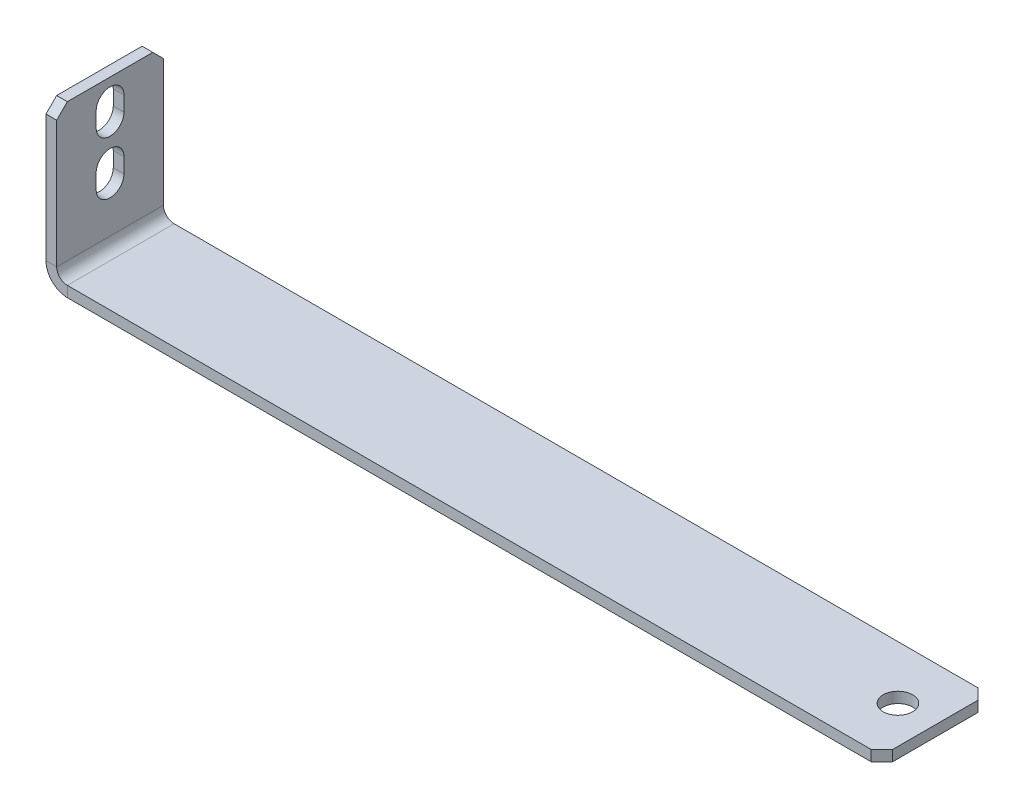
ISO-10303-21;
HEADER;
FILE_DESCRIPTION(('STEP AP214'),'2;1');
FILE_NAME('part.step','',(''),(''),'','','');
FILE_SCHEMA(('AUTOMOTIVE_DESIGN { 1 0 10303 214 1 1 1 1 }'));
ENDSEC;
DATA;
#1=APPLICATION_CONTEXT('core data for automotive mechanical design processes');
#2=APPLICATION_PROTOCOL_DEFINITION('international standard','automotive_design',2000,#1);
#3=PRODUCT_CONTEXT('',#1,'mechanical');
#4=PRODUCT('Part','Part','',(#3));
#5=PRODUCT_RELATED_PRODUCT_CATEGORY('part','',(#4));
#6=PRODUCT_DEFINITION_FORMATION('','',#4);
#7=PRODUCT_DEFINITION_CONTEXT('part definition',#1,'design');
#8=PRODUCT_DEFINITION('design','',#6,#7);
#9=PRODUCT_DEFINITION_SHAPE('','',#8);
#10=(LENGTH_UNIT() NAMED_UNIT(*) SI_UNIT(.MILLI.,.METRE.));
#11=(NAMED_UNIT(*) PLANE_ANGLE_UNIT() SI_UNIT($,.RADIAN.));
#12=(NAMED_UNIT(*) SI_UNIT($,.STERADIAN.) SOLID_ANGLE_UNIT());
#13=UNCERTAINTY_MEASURE_WITH_UNIT(LENGTH_MEASURE(1.E-05),#10,'distance_accuracy_value','');
#14=(GEOMETRIC_REPRESENTATION_CONTEXT(3) GLOBAL_UNCERTAINTY_ASSIGNED_CONTEXT((#13)) GLOBAL_UNIT_ASSIGNED_CONTEXT((#10,
#11,#12)) REPRESENTATION_CONTEXT('',''));
#15=CARTESIAN_POINT('',(0.,0.,0.));
#16=DIRECTION('',(0.,0.,1.));
#17=DIRECTION('',(1.,0.,0.));
#18=AXIS2_PLACEMENT_3D('',#15,#16,#17);
#19=CARTESIAN_POINT('',(-391.45,10.,50.));
#20=DIRECTION('',(0.,0.,1.));
#21=DIRECTION('',(1.,0.,0.));
#22=AXIS2_PLACEMENT_3D('',#19,#20,#21);
#23=PLANE('',#22);
#24=DIRECTION('',(1.,0.,0.));
#25=VECTOR('',#24,1.);
#26=CARTESIAN_POINT('',(-391.45,10.,50.));
#27=LINE('',#26,#25);
#28=CARTESIAN_POINT('',(-391.45,10.,50.));
#29=VERTEX_POINT('',#28);
#30=CARTESIAN_POINT('',(-386.45,10.,50.));
#31=VERTEX_POINT('',#30);
#32=EDGE_CURVE('E316',#29,#31,#27,.T.);
#33=ORIENTED_EDGE('',*,*,#32,.F.);
#34=CARTESIAN_POINT('',(-381.45,10.,50.));
#35=DIRECTION('',(0.,0.,1.));
#36=DIRECTION('',(1.,0.,0.));
#37=AXIS2_PLACEMENT_3D('',#34,#35,#36);
#38=CIRCLE('',#37,10.);
#39=CARTESIAN_POINT('',(-381.45,0.,50.));
#40=VERTEX_POINT('',#39);
#41=EDGE_CURVE('E272',#29,#40,#38,.T.);
#42=ORIENTED_EDGE('',*,*,#41,.T.);
#43=DIRECTION('',(0.,-1.,0.));
#44=VECTOR('',#43,1.);
#45=CARTESIAN_POINT('',(-381.45,5.,50.));
#46=LINE('',#45,#44);
#47=CARTESIAN_POINT('',(-381.45,5.,50.));
#48=VERTEX_POINT('',#47);
#49=EDGE_CURVE('E314',#48,#40,#46,.T.);
#50=ORIENTED_EDGE('',*,*,#49,.F.);
#51=CARTESIAN_POINT('',(-381.45,10.,50.));
#52=DIRECTION('',(0.,0.,1.));
#53=DIRECTION('',(1.,0.,0.));
#54=AXIS2_PLACEMENT_3D('',#51,#52,#53);
#55=CIRCLE('',#54,5.);
#56=EDGE_CURVE('E265',#31,#48,#55,.T.);
#57=ORIENTED_EDGE('',*,*,#56,.F.);
#58=EDGE_LOOP('',(#33,#42,#50,#57));
#59=FACE_BOUND('',#58,.T.);
#60=ADVANCED_FACE('F45',(#59),#23,.T.);
#61=CARTESIAN_POINT('',(-381.45,5.,50.));
#62=DIRECTION('',(0.,0.,1.));
#63=DIRECTION('',(1.,0.,0.));
#64=AXIS2_PLACEMENT_3D('',#61,#62,#63);
#65=PLANE('',#64);
#66=DIRECTION('',(0.,1.,0.));
#67=VECTOR('',#66,1.);
#68=CARTESIAN_POINT('',(-386.45,0.,50.));
#69=LINE('',#68,#67);
#70=CARTESIAN_POINT('',(-386.45,69.5,50.));
#71=VERTEX_POINT('',#70);
#72=EDGE_CURVE('E268',#71,#31,#69,.F.);
#73=ORIENTED_EDGE('',*,*,#72,.F.);
#74=DIRECTION('',(-1.,0.,0.));
#75=VECTOR('',#74,1.);
#76=CARTESIAN_POINT('',(-381.45,69.5,50.));
#77=LINE('',#76,#75);
#78=CARTESIAN_POINT('',(-391.45,69.5,50.));
#79=VERTEX_POINT('',#78);
#80=EDGE_CURVE('E335',#71,#79,#77,.T.);
#81=ORIENTED_EDGE('',*,*,#80,.T.);
#82=DIRECTION('',(0.,-1.,0.));
#83=VECTOR('',#82,1.);
#84=CARTESIAN_POINT('',(-391.45,0.,50.));
#85=LINE('',#84,#83);
#86=EDGE_CURVE('E270',#79,#29,#85,.T.);
#87=ORIENTED_EDGE('',*,*,#86,.T.);
#88=ORIENTED_EDGE('',*,*,#32,.T.);
#89=EDGE_LOOP('',(#73,#81,#87,#88));
#90=FACE_BOUND('',#89,.T.);
#91=ADVANCED_FACE('F398',(#90),#65,.T.);
#92=CARTESIAN_POINT('',(-381.45,0.,0.));
#93=DIRECTION('',(0.,0.,-1.));
#94=DIRECTION('',(-1.,0.,0.));
#95=AXIS2_PLACEMENT_3D('',#92,#93,#94);
#96=PLANE('',#95);
#97=DIRECTION('',(0.,1.,0.));
#98=VECTOR('',#97,1.);
#99=CARTESIAN_POINT('',(-381.45,0.,0.));
#100=LINE('',#99,#98);
#101=CARTESIAN_POINT('',(-381.45,0.,0.));
#102=VERTEX_POINT('',#101);
#103=CARTESIAN_POINT('',(-381.45,5.,0.));
#104=VERTEX_POINT('',#103);
#105=EDGE_CURVE('E312',#102,#104,#100,.T.);
#106=ORIENTED_EDGE('',*,*,#105,.F.);
#107=CARTESIAN_POINT('',(-381.45,10.,0.));
#108=DIRECTION('',(0.,0.,1.));
#109=DIRECTION('',(1.,0.,0.));
#110=AXIS2_PLACEMENT_3D('',#107,#108,#109);
#111=CIRCLE('',#110,10.);
#112=CARTESIAN_POINT('',(-391.45,10.,0.));
#113=VERTEX_POINT('',#112);
#114=EDGE_CURVE('E263',#113,#102,#111,.T.);
#115=ORIENTED_EDGE('',*,*,#114,.F.);
#116=DIRECTION('',(-1.,0.,0.));
#117=VECTOR('',#116,1.);
#118=CARTESIAN_POINT('',(-386.45,10.,0.));
#119=LINE('',#118,#117);
#120=CARTESIAN_POINT('',(-386.45,10.,0.));
#121=VERTEX_POINT('',#120);
#122=EDGE_CURVE('E309',#121,#113,#119,.T.);
#123=ORIENTED_EDGE('',*,*,#122,.F.);
#124=CARTESIAN_POINT('',(-381.45,10.,0.));
#125=DIRECTION('',(0.,0.,1.));
#126=DIRECTION('',(1.,0.,0.));
#127=AXIS2_PLACEMENT_3D('',#124,#125,#126);
#128=CIRCLE('',#127,5.);
#129=EDGE_CURVE('E281',#121,#104,#128,.T.);
#130=ORIENTED_EDGE('',*,*,#129,.T.);
#131=EDGE_LOOP('',(#106,#115,#123,#130));
#132=FACE_BOUND('',#131,.T.);
#133=ADVANCED_FACE('F388',(#132),#96,.T.);
#134=CARTESIAN_POINT('',(-386.45,10.,0.));
#135=DIRECTION('',(0.,0.,-1.));
#136=DIRECTION('',(-1.,0.,0.));
#137=AXIS2_PLACEMENT_3D('',#134,#135,#136);
#138=PLANE('',#137);
#139=DIRECTION('',(1.,0.,0.));
#140=VECTOR('',#139,1.);
#141=CARTESIAN_POINT('',(-391.45,5.,0.));
#142=LINE('',#141,#140);
#143=CARTESIAN_POINT('',(-5.00000000000006,5.,0.));
#144=VERTEX_POINT('',#143);
#145=EDGE_CURVE('E278',#104,#144,#142,.T.);
#146=ORIENTED_EDGE('',*,*,#145,.T.);
#147=DIRECTION('',(0.,-1.,0.));
#148=VECTOR('',#147,1.);
#149=CARTESIAN_POINT('',(-5.00000000000006,10.,0.));
#150=LINE('',#149,#148);
#151=CARTESIAN_POINT('',(-5.00000000000006,0.,0.));
#152=VERTEX_POINT('',#151);
#153=EDGE_CURVE('E339',#144,#152,#150,.T.);
#154=ORIENTED_EDGE('',*,*,#153,.T.);
#155=DIRECTION('',(1.,0.,0.));
#156=VECTOR('',#155,1.);
#157=CARTESIAN_POINT('',(-391.45,0.,0.));
#158=LINE('',#157,#156);
#159=EDGE_CURVE('E259',#102,#152,#158,.T.);
#160=ORIENTED_EDGE('',*,*,#159,.F.);
#161=ORIENTED_EDGE('',*,*,#105,.T.);
#162=EDGE_LOOP('',(#146,#154,#160,#161));
#163=FACE_BOUND('',#162,.T.);
#164=ADVANCED_FACE('F371',(#163),#138,.T.);
#165=CARTESIAN_POINT('',(-391.45,0.,50.));
#166=DIRECTION('',(0.,1.,0.));
#167=DIRECTION('',(0.,0.,1.));
#168=AXIS2_PLACEMENT_3D('',#165,#166,#167);
#169=PLANE('',#168);
#170=CARTESIAN_POINT('',(-17.5,0.,25.));
#171=DIRECTION('',(0.,1.,0.));
#172=DIRECTION('',(0.,0.,1.));
#173=AXIS2_PLACEMENT_3D('',#170,#171,#172);
#174=CIRCLE('',#173,6.90000000000001);
#175=CARTESIAN_POINT('',(-17.5,0.,31.9));
#176=VERTEX_POINT('',#175);
#177=EDGE_CURVE('E256',#176,#176,#174,.T.);
#178=ORIENTED_EDGE('',*,*,#177,.T.);
#179=EDGE_LOOP('',(#178));
#180=FACE_BOUND('',#179,.T.);
#181=DIRECTION('',(0.,0.,-1.));
#182=VECTOR('',#181,1.);
#183=CARTESIAN_POINT('',(0.,0.,50.));
#184=LINE('',#183,#182);
#185=CARTESIAN_POINT('',(0.,0.,45.));
#186=VERTEX_POINT('',#185);
#187=CARTESIAN_POINT('',(0.,0.,5.00000000000003));
#188=VERTEX_POINT('',#187);
#189=EDGE_CURVE('E307',#186,#188,#184,.T.);
#190=ORIENTED_EDGE('',*,*,#189,.F.);
#191=DIRECTION('',(0.707106781186549,0.,-0.707106781186546));
#192=VECTOR('',#191,1.);
#193=CARTESIAN_POINT('',(0.,0.,45.));
#194=LINE('',#193,#192);
#195=CARTESIAN_POINT('',(-5.00000000000006,0.,50.));
#196=VERTEX_POINT('',#195);
#197=EDGE_CURVE('E67',#186,#196,#194,.F.);
#198=ORIENTED_EDGE('',*,*,#197,.T.);
#199=DIRECTION('',(1.,0.,0.));
#200=VECTOR('',#199,1.);
#201=CARTESIAN_POINT('',(-391.45,0.,50.));
#202=LINE('',#201,#200);
#203=EDGE_CURVE('E260',#40,#196,#202,.T.);
#204=ORIENTED_EDGE('',*,*,#203,.F.);
#205=DIRECTION('',(0.,0.,-1.));
#206=VECTOR('',#205,1.);
#207=CARTESIAN_POINT('',(-381.45,0.,50.));
#208=LINE('',#207,#206);
#209=EDGE_CURVE('E275',#40,#102,#208,.T.);
#210=ORIENTED_EDGE('',*,*,#209,.T.);
#211=ORIENTED_EDGE('',*,*,#159,.T.);
#212=DIRECTION('',(-0.707106781186549,0.,-0.707106781186546));
#213=VECTOR('',#212,1.);
#214=CARTESIAN_POINT('',(-5.00000000000006,0.,0.));
#215=LINE('',#214,#213);
#216=EDGE_CURVE('E342',#152,#188,#215,.F.);
#217=ORIENTED_EDGE('',*,*,#216,.T.);
#218=EDGE_LOOP('',(#190,#198,#204,#210,#211,#217));
#219=FACE_BOUND('',#218,.T.);
#220=ADVANCED_FACE('F359',(#180,#219),#169,.F.);
#221=CARTESIAN_POINT('',(0.,5.,50.));
#222=DIRECTION('',(1.,0.,0.));
#223=DIRECTION('',(0.,0.,-1.));
#224=AXIS2_PLACEMENT_3D('',#221,#222,#223);
#225=PLANE('',#224);
#226=DIRECTION('',(0.,0.,-1.));
#227=VECTOR('',#226,1.);
#228=CARTESIAN_POINT('',(0.,5.,50.));
#229=LINE('',#228,#227);
#230=CARTESIAN_POINT('',(0.,5.,45.));
#231=VERTEX_POINT('',#230);
#232=CARTESIAN_POINT('',(0.,5.,5.00000000000003));
#233=VERTEX_POINT('',#232);
#234=EDGE_CURVE('E305',#231,#233,#229,.T.);
#235=ORIENTED_EDGE('',*,*,#234,.F.);
#236=DIRECTION('',(0.,-1.,0.));
#237=VECTOR('',#236,1.);
#238=CARTESIAN_POINT('',(0.,5.,45.));
#239=LINE('',#238,#237);
#240=EDGE_CURVE('E350',#231,#186,#239,.T.);
#241=ORIENTED_EDGE('',*,*,#240,.T.);
#242=ORIENTED_EDGE('',*,*,#189,.T.);
#243=DIRECTION('',(0.,1.,0.));
#244=VECTOR('',#243,1.);
#245=CARTESIAN_POINT('',(0.,5.,5.00000000000003));
#246=LINE('',#245,#244);
#247=EDGE_CURVE('E345',#188,#233,#246,.T.);
#248=ORIENTED_EDGE('',*,*,#247,.T.);
#249=EDGE_LOOP('',(#235,#241,#242,#248));
#250=FACE_BOUND('',#249,.T.);
#251=ADVANCED_FACE('F356',(#250),#225,.T.);
#252=CARTESIAN_POINT('',(-391.45,5.,50.));
#253=DIRECTION('',(0.,1.,0.));
#254=DIRECTION('',(0.,0.,1.));
#255=AXIS2_PLACEMENT_3D('',#252,#253,#254);
#256=PLANE('',#255);
#257=CARTESIAN_POINT('',(-17.5,5.,25.));
#258=DIRECTION('',(0.,1.,0.));
#259=DIRECTION('',(0.,0.,1.));
#260=AXIS2_PLACEMENT_3D('',#257,#258,#259);
#261=CIRCLE('',#260,6.90000000000001);
#262=CARTESIAN_POINT('',(-17.5,5.,31.9));
#263=VERTEX_POINT('',#262);
#264=EDGE_CURVE('E253',#263,#263,#261,.T.);
#265=ORIENTED_EDGE('',*,*,#264,.F.);
#266=EDGE_LOOP('',(#265));
#267=FACE_BOUND('',#266,.T.);
#268=DIRECTION('',(1.,0.,0.));
#269=VECTOR('',#268,1.);
#270=CARTESIAN_POINT('',(-391.45,5.,50.));
#271=LINE('',#270,#269);
#272=CARTESIAN_POINT('',(-5.00000000000006,5.,50.));
#273=VERTEX_POINT('',#272);
#274=EDGE_CURVE('E262',#48,#273,#271,.T.);
#275=ORIENTED_EDGE('',*,*,#274,.T.);
#276=DIRECTION('',(-0.707106781186549,0.,0.707106781186546));
#277=VECTOR('',#276,1.);
#278=CARTESIAN_POINT('',(-198.225000000001,5.,243.225));
#279=LINE('',#278,#277);
#280=EDGE_CURVE('E11',#273,#231,#279,.F.);
#281=ORIENTED_EDGE('',*,*,#280,.T.);
#282=ORIENTED_EDGE('',*,*,#234,.T.);
#283=DIRECTION('',(0.707106781186549,0.,0.707106781186546));
#284=VECTOR('',#283,1.);
#285=CARTESIAN_POINT('',(-173.225000000001,5.,-168.225));
#286=LINE('',#285,#284);
#287=EDGE_CURVE('E348',#233,#144,#286,.F.);
#288=ORIENTED_EDGE('',*,*,#287,.T.);
#289=ORIENTED_EDGE('',*,*,#145,.F.);
#290=DIRECTION('',(0.,0.,-1.));
#291=VECTOR('',#290,1.);
#292=CARTESIAN_POINT('',(-381.45,5.,50.));
#293=LINE('',#292,#291);
#294=EDGE_CURVE('E302',#48,#104,#293,.T.);
#295=ORIENTED_EDGE('',*,*,#294,.F.);
#296=EDGE_LOOP('',(#275,#281,#282,#288,#289,#295));
#297=FACE_BOUND('',#296,.T.);
#298=ADVANCED_FACE('F368',(#267,#297),#256,.T.);
#299=CARTESIAN_POINT('',(-381.45,10.,50.));
#300=DIRECTION('',(0.,0.,-1.));
#301=DIRECTION('',(-1.,0.,0.));
#302=AXIS2_PLACEMENT_3D('',#299,#300,#301);
#303=CYLINDRICAL_SURFACE('',#302,5.);
#304=ORIENTED_EDGE('',*,*,#129,.F.);
#305=DIRECTION('',(0.,0.,-1.));
#306=VECTOR('',#305,1.);
#307=CARTESIAN_POINT('',(-386.45,10.,50.));
#308=LINE('',#307,#306);
#309=EDGE_CURVE('E299',#31,#121,#308,.T.);
#310=ORIENTED_EDGE('',*,*,#309,.F.);
#311=ORIENTED_EDGE('',*,*,#56,.T.);
#312=ORIENTED_EDGE('',*,*,#294,.T.);
#313=EDGE_LOOP('',(#304,#310,#311,#312));
#314=FACE_BOUND('',#313,.T.);
#315=ADVANCED_FACE('F376',(#314),#303,.F.);
#316=CARTESIAN_POINT('',(-386.45,0.,50.));
#317=DIRECTION('',(1.,0.,0.));
#318=DIRECTION('',(0.,0.,-1.));
#319=AXIS2_PLACEMENT_3D('',#316,#317,#318);
#320=PLANE('',#319);
#321=DIRECTION('',(0.,1.,0.));
#322=VECTOR('',#321,1.);
#323=CARTESIAN_POINT('',(-386.45,0.,18.5));
#324=LINE('',#323,#322);
#325=CARTESIAN_POINT('',(-386.45,32.,18.5));
#326=VERTEX_POINT('',#325);
#327=CARTESIAN_POINT('',(-386.45,39.,18.5));
#328=VERTEX_POINT('',#327);
#329=EDGE_CURVE('E251',#326,#328,#324,.T.);
#330=ORIENTED_EDGE('',*,*,#329,.F.);
#331=CARTESIAN_POINT('',(-386.45,32.,25.));
#332=DIRECTION('',(1.,0.,0.));
#333=DIRECTION('',(0.,0.,-1.));
#334=AXIS2_PLACEMENT_3D('',#331,#332,#333);
#335=CIRCLE('',#334,6.5);
#336=CARTESIAN_POINT('',(-386.45,32.,31.5));
#337=VERTEX_POINT('',#336);
#338=EDGE_CURVE('E246',#337,#326,#335,.T.);
#339=ORIENTED_EDGE('',*,*,#338,.F.);
#340=DIRECTION('',(0.,1.,0.));
#341=VECTOR('',#340,1.);
#342=CARTESIAN_POINT('',(-386.45,0.,31.5));
#343=LINE('',#342,#341);
#344=CARTESIAN_POINT('',(-386.45,39.,31.5));
#345=VERTEX_POINT('',#344);
#346=EDGE_CURVE('E190',#337,#345,#343,.T.);
#347=ORIENTED_EDGE('',*,*,#346,.T.);
#348=CARTESIAN_POINT('',(-386.45,39.,25.));
#349=DIRECTION('',(1.,0.,0.));
#350=DIRECTION('',(0.,0.,-1.));
#351=AXIS2_PLACEMENT_3D('',#348,#349,#350);
#352=CIRCLE('',#351,6.5);
#353=EDGE_CURVE('E249',#328,#345,#352,.T.);
#354=ORIENTED_EDGE('',*,*,#353,.F.);
#355=EDGE_LOOP('',(#330,#339,#347,#354));
#356=FACE_BOUND('',#355,.T.);
#357=DIRECTION('',(0.,1.,0.));
#358=VECTOR('',#357,1.);
#359=CARTESIAN_POINT('',(-386.45,0.,18.5));
#360=LINE('',#359,#358);
#361=CARTESIAN_POINT('',(-386.45,57.,18.5));
#362=VERTEX_POINT('',#361);
#363=CARTESIAN_POINT('',(-386.45,64.,18.5));
#364=VERTEX_POINT('',#363);
#365=EDGE_CURVE('E244',#362,#364,#360,.T.);
#366=ORIENTED_EDGE('',*,*,#365,.F.);
#367=CARTESIAN_POINT('',(-386.45,57.,25.));
#368=DIRECTION('',(1.,0.,0.));
#369=DIRECTION('',(0.,0.,-1.));
#370=AXIS2_PLACEMENT_3D('',#367,#368,#369);
#371=CIRCLE('',#370,6.5);
#372=CARTESIAN_POINT('',(-386.45,57.,31.5));
#373=VERTEX_POINT('',#372);
#374=EDGE_CURVE('E215',#373,#362,#371,.T.);
#375=ORIENTED_EDGE('',*,*,#374,.F.);
#376=DIRECTION('',(0.,1.,0.));
#377=VECTOR('',#376,1.);
#378=CARTESIAN_POINT('',(-386.45,0.,31.5));
#379=LINE('',#378,#377);
#380=CARTESIAN_POINT('',(-386.45,64.,31.5));
#381=VERTEX_POINT('',#380);
#382=EDGE_CURVE('E239',#373,#381,#379,.T.);
#383=ORIENTED_EDGE('',*,*,#382,.T.);
#384=CARTESIAN_POINT('',(-386.45,64.,25.));
#385=DIRECTION('',(1.,0.,0.));
#386=DIRECTION('',(0.,0.,-1.));
#387=AXIS2_PLACEMENT_3D('',#384,#385,#386);
#388=CIRCLE('',#387,6.5);
#389=EDGE_CURVE('E242',#364,#381,#388,.T.);
#390=ORIENTED_EDGE('',*,*,#389,.F.);
#391=EDGE_LOOP('',(#366,#375,#383,#390));
#392=FACE_BOUND('',#391,.T.);
#393=DIRECTION('',(0.,0.,-1.));
#394=VECTOR('',#393,1.);
#395=CARTESIAN_POINT('',(-386.45,74.5,50.));
#396=LINE('',#395,#394);
#397=CARTESIAN_POINT('',(-386.45,74.5,45.));
#398=VERTEX_POINT('',#397);
#399=CARTESIAN_POINT('',(-386.45,74.5,5.00000000000003));
#400=VERTEX_POINT('',#399);
#401=EDGE_CURVE('E297',#398,#400,#396,.T.);
#402=ORIENTED_EDGE('',*,*,#401,.F.);
#403=DIRECTION('',(0.,0.707106781186548,-0.707106781186548));
#404=VECTOR('',#403,1.);
#405=CARTESIAN_POINT('',(-386.45,34.75,84.75));
#406=LINE('',#405,#404);
#407=EDGE_CURVE('E333',#398,#71,#406,.F.);
#408=ORIENTED_EDGE('',*,*,#407,.T.);
#409=ORIENTED_EDGE('',*,*,#72,.T.);
#410=ORIENTED_EDGE('',*,*,#309,.T.);
#411=DIRECTION('',(0.,1.,0.));
#412=VECTOR('',#411,1.);
#413=CARTESIAN_POINT('',(-386.45,0.,0.));
#414=LINE('',#413,#412);
#415=CARTESIAN_POINT('',(-386.45,69.5,0.));
#416=VERTEX_POINT('',#415);
#417=EDGE_CURVE('E284',#416,#121,#414,.F.);
#418=ORIENTED_EDGE('',*,*,#417,.F.);
#419=DIRECTION('',(0.,0.707106781186548,0.707106781186548));
#420=VECTOR('',#419,1.);
#421=CARTESIAN_POINT('',(-386.45,59.75,-9.74999999999997));
#422=LINE('',#421,#420);
#423=EDGE_CURVE('E322',#416,#400,#422,.T.);
#424=ORIENTED_EDGE('',*,*,#423,.T.);
#425=EDGE_LOOP('',(#402,#408,#409,#410,#418,#424));
#426=FACE_BOUND('',#425,.T.);
#427=ADVANCED_FACE('F394',(#356,#392,#426),#320,.T.);
#428=CARTESIAN_POINT('',(-391.45,74.5,50.));
#429=DIRECTION('',(0.,1.,0.));
#430=DIRECTION('',(0.,0.,1.));
#431=AXIS2_PLACEMENT_3D('',#428,#429,#430);
#432=PLANE('',#431);
#433=DIRECTION('',(0.,0.,-1.));
#434=VECTOR('',#433,1.);
#435=CARTESIAN_POINT('',(-391.45,74.5,50.));
#436=LINE('',#435,#434);
#437=CARTESIAN_POINT('',(-391.45,74.5,45.));
#438=VERTEX_POINT('',#437);
#439=CARTESIAN_POINT('',(-391.45,74.5,5.00000000000003));
#440=VERTEX_POINT('',#439);
#441=EDGE_CURVE('E295',#438,#440,#436,.T.);
#442=ORIENTED_EDGE('',*,*,#441,.F.);
#443=DIRECTION('',(1.,0.,0.));
#444=VECTOR('',#443,1.);
#445=CARTESIAN_POINT('',(-391.45,74.5,45.));
#446=LINE('',#445,#444);
#447=EDGE_CURVE('E330',#438,#398,#446,.T.);
#448=ORIENTED_EDGE('',*,*,#447,.T.);
#449=ORIENTED_EDGE('',*,*,#401,.T.);
#450=DIRECTION('',(-1.,0.,0.));
#451=VECTOR('',#450,1.);
#452=CARTESIAN_POINT('',(-391.45,74.5,5.00000000000003));
#453=LINE('',#452,#451);
#454=EDGE_CURVE('E325',#400,#440,#453,.T.);
#455=ORIENTED_EDGE('',*,*,#454,.T.);
#456=EDGE_LOOP('',(#442,#448,#449,#455));
#457=FACE_BOUND('',#456,.T.);
#458=ADVANCED_FACE('F407',(#457),#432,.T.);
#459=CARTESIAN_POINT('',(-391.45,0.,50.));
#460=DIRECTION('',(1.,0.,0.));
#461=DIRECTION('',(0.,0.,-1.));
#462=AXIS2_PLACEMENT_3D('',#459,#460,#461);
#463=PLANE('',#462);
#464=CARTESIAN_POINT('',(-391.45,32.,25.));
#465=DIRECTION('',(-1.,0.,0.));
#466=DIRECTION('',(0.,0.,1.));
#467=AXIS2_PLACEMENT_3D('',#464,#465,#466);
#468=CIRCLE('',#467,6.5);
#469=CARTESIAN_POINT('',(-391.45,32.,18.5));
#470=VERTEX_POINT('',#469);
#471=CARTESIAN_POINT('',(-391.45,32.,31.5));
#472=VERTEX_POINT('',#471);
#473=EDGE_CURVE('E198',#470,#472,#468,.T.);
#474=ORIENTED_EDGE('',*,*,#473,.F.);
#475=DIRECTION('',(0.,-1.,0.));
#476=VECTOR('',#475,1.);
#477=CARTESIAN_POINT('',(-391.45,0.,18.5));
#478=LINE('',#477,#476);
#479=CARTESIAN_POINT('',(-391.45,39.,18.5));
#480=VERTEX_POINT('',#479);
#481=EDGE_CURVE('E203',#480,#470,#478,.T.);
#482=ORIENTED_EDGE('',*,*,#481,.F.);
#483=CARTESIAN_POINT('',(-391.45,39.,25.));
#484=DIRECTION('',(-1.,0.,0.));
#485=DIRECTION('',(0.,0.,1.));
#486=AXIS2_PLACEMENT_3D('',#483,#484,#485);
#487=CIRCLE('',#486,6.5);
#488=CARTESIAN_POINT('',(-391.45,39.,31.5));
#489=VERTEX_POINT('',#488);
#490=EDGE_CURVE('E208',#489,#480,#487,.T.);
#491=ORIENTED_EDGE('',*,*,#490,.F.);
#492=DIRECTION('',(0.,-1.,0.));
#493=VECTOR('',#492,1.);
#494=CARTESIAN_POINT('',(-391.45,0.,31.5));
#495=LINE('',#494,#493);
#496=EDGE_CURVE('E187',#489,#472,#495,.T.);
#497=ORIENTED_EDGE('',*,*,#496,.T.);
#498=EDGE_LOOP('',(#474,#482,#491,#497));
#499=FACE_BOUND('',#498,.T.);
#500=CARTESIAN_POINT('',(-391.45,57.,25.));
#501=DIRECTION('',(-1.,0.,0.));
#502=DIRECTION('',(0.,0.,1.));
#503=AXIS2_PLACEMENT_3D('',#500,#501,#502);
#504=CIRCLE('',#503,6.5);
#505=CARTESIAN_POINT('',(-391.45,57.,18.5));
#506=VERTEX_POINT('',#505);
#507=CARTESIAN_POINT('',(-391.45,57.,31.5));
#508=VERTEX_POINT('',#507);
#509=EDGE_CURVE('E220',#506,#508,#504,.T.);
#510=ORIENTED_EDGE('',*,*,#509,.F.);
#511=DIRECTION('',(0.,-1.,0.));
#512=VECTOR('',#511,1.);
#513=CARTESIAN_POINT('',(-391.45,0.,18.5));
#514=LINE('',#513,#512);
#515=CARTESIAN_POINT('',(-391.45,64.,18.5));
#516=VERTEX_POINT('',#515);
#517=EDGE_CURVE('E218',#516,#506,#514,.T.);
#518=ORIENTED_EDGE('',*,*,#517,.F.);
#519=CARTESIAN_POINT('',(-391.45,64.,25.));
#520=DIRECTION('',(-1.,0.,0.));
#521=DIRECTION('',(0.,0.,1.));
#522=AXIS2_PLACEMENT_3D('',#519,#520,#521);
#523=CIRCLE('',#522,6.5);
#524=CARTESIAN_POINT('',(-391.45,64.,31.5));
#525=VERTEX_POINT('',#524);
#526=EDGE_CURVE('E226',#525,#516,#523,.T.);
#527=ORIENTED_EDGE('',*,*,#526,.F.);
#528=DIRECTION('',(0.,-1.,0.));
#529=VECTOR('',#528,1.);
#530=CARTESIAN_POINT('',(-391.45,0.,31.5));
#531=LINE('',#530,#529);
#532=EDGE_CURVE('E223',#525,#508,#531,.T.);
#533=ORIENTED_EDGE('',*,*,#532,.T.);
#534=EDGE_LOOP('',(#510,#518,#527,#533));
#535=FACE_BOUND('',#534,.T.);
#536=ORIENTED_EDGE('',*,*,#86,.F.);
#537=DIRECTION('',(0.,-0.707106781186548,0.707106781186548));
#538=VECTOR('',#537,1.);
#539=CARTESIAN_POINT('',(-391.45,74.5,45.));
#540=LINE('',#539,#538);
#541=EDGE_CURVE('E337',#79,#438,#540,.F.);
#542=ORIENTED_EDGE('',*,*,#541,.T.);
#543=ORIENTED_EDGE('',*,*,#441,.T.);
#544=DIRECTION('',(0.,-0.707106781186548,-0.707106781186548));
#545=VECTOR('',#544,1.);
#546=CARTESIAN_POINT('',(-391.45,69.5,0.));
#547=LINE('',#546,#545);
#548=CARTESIAN_POINT('',(-391.45,69.5,0.));
#549=VERTEX_POINT('',#548);
#550=EDGE_CURVE('E328',#440,#549,#547,.T.);
#551=ORIENTED_EDGE('',*,*,#550,.T.);
#552=DIRECTION('',(0.,-1.,0.));
#553=VECTOR('',#552,1.);
#554=CARTESIAN_POINT('',(-391.45,0.,0.));
#555=LINE('',#554,#553);
#556=EDGE_CURVE('E286',#549,#113,#555,.T.);
#557=ORIENTED_EDGE('',*,*,#556,.T.);
#558=DIRECTION('',(0.,0.,-1.));
#559=VECTOR('',#558,1.);
#560=CARTESIAN_POINT('',(-391.45,10.,50.));
#561=LINE('',#560,#559);
#562=EDGE_CURVE('E292',#29,#113,#561,.T.);
#563=ORIENTED_EDGE('',*,*,#562,.F.);
#564=EDGE_LOOP('',(#536,#542,#543,#551,#557,#563));
#565=FACE_BOUND('',#564,.T.);
#566=ADVANCED_FACE('F205',(#499,#535,#565),#463,.F.);
#567=CARTESIAN_POINT('',(-381.45,10.,50.));
#568=DIRECTION('',(0.,0.,-1.));
#569=DIRECTION('',(-1.,0.,0.));
#570=AXIS2_PLACEMENT_3D('',#567,#568,#569);
#571=CYLINDRICAL_SURFACE('',#570,10.);
#572=ORIENTED_EDGE('',*,*,#114,.T.);
#573=ORIENTED_EDGE('',*,*,#209,.F.);
#574=ORIENTED_EDGE('',*,*,#41,.F.);
#575=ORIENTED_EDGE('',*,*,#562,.T.);
#576=EDGE_LOOP('',(#572,#573,#574,#575));
#577=FACE_BOUND('',#576,.T.);
#578=ADVANCED_FACE('F386',(#577),#571,.T.);
#579=CARTESIAN_POINT('',(-381.45,10.,50.));
#580=DIRECTION('',(0.,0.,1.));
#581=DIRECTION('',(1.,0.,0.));
#582=AXIS2_PLACEMENT_3D('',#579,#580,#581);
#583=PLANE('',#582);
#584=ORIENTED_EDGE('',*,*,#203,.T.);
#585=DIRECTION('',(0.,1.,0.));
#586=VECTOR('',#585,1.);
#587=CARTESIAN_POINT('',(-5.00000000000006,10.,50.));
#588=LINE('',#587,#586);
#589=EDGE_CURVE('E53',#196,#273,#588,.T.);
#590=ORIENTED_EDGE('',*,*,#589,.T.);
#591=ORIENTED_EDGE('',*,*,#274,.F.);
#592=ORIENTED_EDGE('',*,*,#49,.T.);
#593=EDGE_LOOP('',(#584,#590,#591,#592));
#594=FACE_BOUND('',#593,.T.);
#595=ADVANCED_FACE('F379',(#594),#583,.T.);
#596=CARTESIAN_POINT('',(-381.45,10.,0.));
#597=DIRECTION('',(0.,0.,1.));
#598=DIRECTION('',(1.,0.,0.));
#599=AXIS2_PLACEMENT_3D('',#596,#597,#598);
#600=PLANE('',#599);
#601=ORIENTED_EDGE('',*,*,#556,.F.);
#602=DIRECTION('',(1.,0.,0.));
#603=VECTOR('',#602,1.);
#604=CARTESIAN_POINT('',(-386.45,69.5,0.));
#605=LINE('',#604,#603);
#606=EDGE_CURVE('E319',#549,#416,#605,.T.);
#607=ORIENTED_EDGE('',*,*,#606,.T.);
#608=ORIENTED_EDGE('',*,*,#417,.T.);
#609=ORIENTED_EDGE('',*,*,#122,.T.);
#610=EDGE_LOOP('',(#601,#607,#608,#609));
#611=FACE_BOUND('',#610,.T.);
#612=ADVANCED_FACE('F413',(#611),#600,.F.);
#613=CARTESIAN_POINT('',(-17.5,-1.,25.));
#614=DIRECTION('',(0.,1.,0.));
#615=DIRECTION('',(0.,0.,1.));
#616=AXIS2_PLACEMENT_3D('',#613,#614,#615);
#617=CYLINDRICAL_SURFACE('',#616,6.90000000000001);
#618=ORIENTED_EDGE('',*,*,#264,.T.);
#619=EDGE_LOOP('',(#618));
#620=FACE_BOUND('',#619,.T.);
#621=ORIENTED_EDGE('',*,*,#177,.F.);
#622=EDGE_LOOP('',(#621));
#623=FACE_BOUND('',#622,.T.);
#624=ADVANCED_FACE('F415',(#620,#623),#617,.F.);
#625=CARTESIAN_POINT('',(-385.45,0.,18.5));
#626=DIRECTION('',(0.,0.,-1.));
#627=DIRECTION('',(0.,1.,0.));
#628=AXIS2_PLACEMENT_3D('',#625,#626,#627);
#629=PLANE('',#628);
#630=ORIENTED_EDGE('',*,*,#365,.T.);
#631=DIRECTION('',(-1.,0.,0.));
#632=VECTOR('',#631,1.);
#633=CARTESIAN_POINT('',(-385.45,64.,18.5));
#634=LINE('',#633,#632);
#635=EDGE_CURVE('E230',#364,#516,#634,.T.);
#636=ORIENTED_EDGE('',*,*,#635,.T.);
#637=ORIENTED_EDGE('',*,*,#517,.T.);
#638=DIRECTION('',(-1.,0.,0.));
#639=VECTOR('',#638,1.);
#640=CARTESIAN_POINT('',(-385.45,57.,18.5));
#641=LINE('',#640,#639);
#642=EDGE_CURVE('E229',#362,#506,#641,.T.);
#643=ORIENTED_EDGE('',*,*,#642,.F.);
#644=EDGE_LOOP('',(#630,#636,#637,#643));
#645=FACE_BOUND('',#644,.T.);
#646=ADVANCED_FACE('F422',(#645),#629,.F.);
#647=CARTESIAN_POINT('',(-385.45,64.,25.));
#648=DIRECTION('',(-1.,0.,0.));
#649=DIRECTION('',(0.,0.,1.));
#650=AXIS2_PLACEMENT_3D('',#647,#648,#649);
#651=CYLINDRICAL_SURFACE('',#650,6.5);
#652=ORIENTED_EDGE('',*,*,#389,.T.);
#653=DIRECTION('',(-1.,0.,0.));
#654=VECTOR('',#653,1.);
#655=CARTESIAN_POINT('',(-385.45,64.,31.5));
#656=LINE('',#655,#654);
#657=EDGE_CURVE('E232',#381,#525,#656,.T.);
#658=ORIENTED_EDGE('',*,*,#657,.T.);
#659=ORIENTED_EDGE('',*,*,#526,.T.);
#660=ORIENTED_EDGE('',*,*,#635,.F.);
#661=EDGE_LOOP('',(#652,#658,#659,#660));
#662=FACE_BOUND('',#661,.T.);
#663=ADVANCED_FACE('F526',(#662),#651,.F.);
#664=CARTESIAN_POINT('',(-385.45,0.,31.5));
#665=DIRECTION('',(0.,0.,-1.));
#666=DIRECTION('',(-1.,0.,0.));
#667=AXIS2_PLACEMENT_3D('',#664,#665,#666);
#668=PLANE('',#667);
#669=DIRECTION('',(-1.,0.,0.));
#670=VECTOR('',#669,1.);
#671=CARTESIAN_POINT('',(-385.45,57.,31.5));
#672=LINE('',#671,#670);
#673=EDGE_CURVE('E234',#373,#508,#672,.T.);
#674=ORIENTED_EDGE('',*,*,#673,.T.);
#675=ORIENTED_EDGE('',*,*,#532,.F.);
#676=ORIENTED_EDGE('',*,*,#657,.F.);
#677=ORIENTED_EDGE('',*,*,#382,.F.);
#678=EDGE_LOOP('',(#674,#675,#676,#677));
#679=FACE_BOUND('',#678,.T.);
#680=ADVANCED_FACE('F515',(#679),#668,.T.);
#681=CARTESIAN_POINT('',(-385.45,57.,25.));
#682=DIRECTION('',(-1.,0.,0.));
#683=DIRECTION('',(0.,0.,1.));
#684=AXIS2_PLACEMENT_3D('',#681,#682,#683);
#685=CYLINDRICAL_SURFACE('',#684,6.5);
#686=ORIENTED_EDGE('',*,*,#374,.T.);
#687=ORIENTED_EDGE('',*,*,#642,.T.);
#688=ORIENTED_EDGE('',*,*,#509,.T.);
#689=ORIENTED_EDGE('',*,*,#673,.F.);
#690=EDGE_LOOP('',(#686,#687,#688,#689));
#691=FACE_BOUND('',#690,.T.);
#692=ADVANCED_FACE('F504',(#691),#685,.F.);
#693=CARTESIAN_POINT('',(-385.45,0.,18.5));
#694=DIRECTION('',(0.,0.,-1.));
#695=DIRECTION('',(0.,1.,0.));
#696=AXIS2_PLACEMENT_3D('',#693,#694,#695);
#697=PLANE('',#696);
#698=ORIENTED_EDGE('',*,*,#329,.T.);
#699=DIRECTION('',(-1.,0.,0.));
#700=VECTOR('',#699,1.);
#701=CARTESIAN_POINT('',(-385.45,39.,18.5));
#702=LINE('',#701,#700);
#703=EDGE_CURVE('E213',#328,#480,#702,.T.);
#704=ORIENTED_EDGE('',*,*,#703,.T.);
#705=ORIENTED_EDGE('',*,*,#481,.T.);
#706=DIRECTION('',(-1.,0.,0.));
#707=VECTOR('',#706,1.);
#708=CARTESIAN_POINT('',(-385.45,32.,18.5));
#709=LINE('',#708,#707);
#710=EDGE_CURVE('E194',#326,#470,#709,.T.);
#711=ORIENTED_EDGE('',*,*,#710,.F.);
#712=EDGE_LOOP('',(#698,#704,#705,#711));
#713=FACE_BOUND('',#712,.T.);
#714=ADVANCED_FACE('F493',(#713),#697,.F.);
#715=CARTESIAN_POINT('',(-385.45,39.,25.));
#716=DIRECTION('',(-1.,0.,0.));
#717=DIRECTION('',(0.,0.,1.));
#718=AXIS2_PLACEMENT_3D('',#715,#716,#717);
#719=CYLINDRICAL_SURFACE('',#718,6.5);
#720=ORIENTED_EDGE('',*,*,#353,.T.);
#721=DIRECTION('',(-1.,0.,0.));
#722=VECTOR('',#721,1.);
#723=CARTESIAN_POINT('',(-385.45,39.,31.5));
#724=LINE('',#723,#722);
#725=EDGE_CURVE('E193',#345,#489,#724,.T.);
#726=ORIENTED_EDGE('',*,*,#725,.T.);
#727=ORIENTED_EDGE('',*,*,#490,.T.);
#728=ORIENTED_EDGE('',*,*,#703,.F.);
#729=EDGE_LOOP('',(#720,#726,#727,#728));
#730=FACE_BOUND('',#729,.T.);
#731=ADVANCED_FACE('F483',(#730),#719,.F.);
#732=CARTESIAN_POINT('',(-385.45,0.,31.5));
#733=DIRECTION('',(0.,0.,-1.));
#734=DIRECTION('',(-1.,0.,0.));
#735=AXIS2_PLACEMENT_3D('',#732,#733,#734);
#736=PLANE('',#735);
#737=DIRECTION('',(-1.,0.,0.));
#738=VECTOR('',#737,1.);
#739=CARTESIAN_POINT('',(-385.45,32.,31.5));
#740=LINE('',#739,#738);
#741=EDGE_CURVE('E182',#337,#472,#740,.T.);
#742=ORIENTED_EDGE('',*,*,#741,.T.);
#743=ORIENTED_EDGE('',*,*,#496,.F.);
#744=ORIENTED_EDGE('',*,*,#725,.F.);
#745=ORIENTED_EDGE('',*,*,#346,.F.);
#746=EDGE_LOOP('',(#742,#743,#744,#745));
#747=FACE_BOUND('',#746,.T.);
#748=ADVANCED_FACE('F184',(#747),#736,.T.);
#749=CARTESIAN_POINT('',(-385.45,32.,25.));
#750=DIRECTION('',(-1.,0.,0.));
#751=DIRECTION('',(0.,0.,1.));
#752=AXIS2_PLACEMENT_3D('',#749,#750,#751);
#753=CYLINDRICAL_SURFACE('',#752,6.5);
#754=ORIENTED_EDGE('',*,*,#338,.T.);
#755=ORIENTED_EDGE('',*,*,#710,.T.);
#756=ORIENTED_EDGE('',*,*,#473,.T.);
#757=ORIENTED_EDGE('',*,*,#741,.F.);
#758=EDGE_LOOP('',(#754,#755,#756,#757));
#759=FACE_BOUND('',#758,.T.);
#760=ADVANCED_FACE('F199',(#759),#753,.F.);
#761=CARTESIAN_POINT('',(-381.45,69.5,0.));
#762=DIRECTION('',(0.,0.707106781186547,-0.707106781186547));
#763=DIRECTION('',(-1.,0.,0.));
#764=AXIS2_PLACEMENT_3D('',#761,#762,#763);
#765=PLANE('',#764);
#766=ORIENTED_EDGE('',*,*,#550,.F.);
#767=ORIENTED_EDGE('',*,*,#454,.F.);
#768=ORIENTED_EDGE('',*,*,#423,.F.);
#769=ORIENTED_EDGE('',*,*,#606,.F.);
#770=EDGE_LOOP('',(#766,#767,#768,#769));
#771=FACE_BOUND('',#770,.T.);
#772=ADVANCED_FACE('F412',(#771),#765,.T.);
#773=CARTESIAN_POINT('',(-391.45,74.5,45.));
#774=DIRECTION('',(0.,-0.707106781186547,-0.707106781186547));
#775=DIRECTION('',(1.,0.,0.));
#776=AXIS2_PLACEMENT_3D('',#773,#774,#775);
#777=PLANE('',#776);
#778=ORIENTED_EDGE('',*,*,#541,.F.);
#779=ORIENTED_EDGE('',*,*,#80,.F.);
#780=ORIENTED_EDGE('',*,*,#407,.F.);
#781=ORIENTED_EDGE('',*,*,#447,.F.);
#782=EDGE_LOOP('',(#778,#779,#780,#781));
#783=FACE_BOUND('',#782,.T.);
#784=ADVANCED_FACE('F405',(#783),#777,.F.);
#785=CARTESIAN_POINT('',(-5.00000000000006,10.,0.));
#786=DIRECTION('',(-0.707106781186546,0.,0.707106781186549));
#787=DIRECTION('',(0.,-1.,0.));
#788=AXIS2_PLACEMENT_3D('',#785,#786,#787);
#789=PLANE('',#788);
#790=ORIENTED_EDGE('',*,*,#287,.F.);
#791=ORIENTED_EDGE('',*,*,#247,.F.);
#792=ORIENTED_EDGE('',*,*,#216,.F.);
#793=ORIENTED_EDGE('',*,*,#153,.F.);
#794=EDGE_LOOP('',(#790,#791,#792,#793));
#795=FACE_BOUND('',#794,.T.);
#796=ADVANCED_FACE('F365',(#795),#789,.F.);
#797=CARTESIAN_POINT('',(0.,5.,45.));
#798=DIRECTION('',(-0.707106781186546,0.,-0.707106781186549));
#799=DIRECTION('',(0.,-1.,0.));
#800=AXIS2_PLACEMENT_3D('',#797,#798,#799);
#801=PLANE('',#800);
#802=ORIENTED_EDGE('',*,*,#280,.F.);
#803=ORIENTED_EDGE('',*,*,#589,.F.);
#804=ORIENTED_EDGE('',*,*,#197,.F.);
#805=ORIENTED_EDGE('',*,*,#240,.F.);
#806=EDGE_LOOP('',(#802,#803,#804,#805));
#807=FACE_BOUND('',#806,.T.);
#808=ADVANCED_FACE('F47',(#807),#801,.F.);
#809=CLOSED_SHELL('',(#60,#91,#133,#164,#220,#251,#298,#315,#427,#458,#566,#578,#595,#612,#624,
#646,#663,#680,#692,#714,#731,#748,#760,#772,#784,#796,#808));
#810=MANIFOLD_SOLID_BREP('B2',#809);
#811=ADVANCED_BREP_SHAPE_REPRESENTATION('',(#18,#810),#14);
#812=SHAPE_DEFINITION_REPRESENTATION(#9,#811);
ENDSEC;
END-ISO-10303-21;
